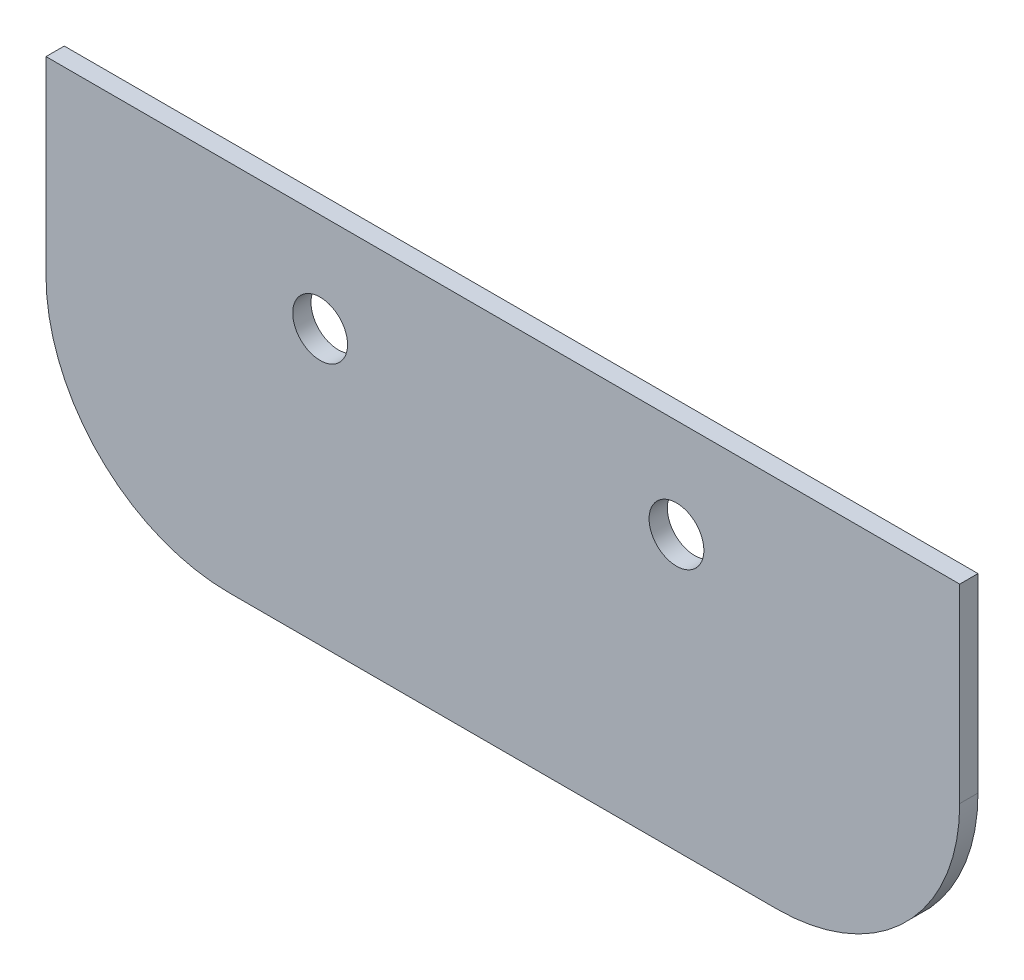
ISO-10303-21;
HEADER;
FILE_DESCRIPTION(('STEP AP214'),'2;1');
FILE_NAME('part.step','',(''),(''),'','','');
FILE_SCHEMA(('AUTOMOTIVE_DESIGN { 1 0 10303 214 1 1 1 1 }'));
ENDSEC;
DATA;
#1=APPLICATION_CONTEXT('core data for automotive mechanical design processes');
#2=APPLICATION_PROTOCOL_DEFINITION('international standard','automotive_design',2000,#1);
#3=PRODUCT_CONTEXT('',#1,'mechanical');
#4=PRODUCT('Part','Part','',(#3));
#5=PRODUCT_RELATED_PRODUCT_CATEGORY('part','',(#4));
#6=PRODUCT_DEFINITION_FORMATION('','',#4);
#7=PRODUCT_DEFINITION_CONTEXT('part definition',#1,'design');
#8=PRODUCT_DEFINITION('design','',#6,#7);
#9=PRODUCT_DEFINITION_SHAPE('','',#8);
#10=(LENGTH_UNIT() NAMED_UNIT(*) SI_UNIT(.MILLI.,.METRE.));
#11=(NAMED_UNIT(*) PLANE_ANGLE_UNIT() SI_UNIT($,.RADIAN.));
#12=(NAMED_UNIT(*) SI_UNIT($,.STERADIAN.) SOLID_ANGLE_UNIT());
#13=UNCERTAINTY_MEASURE_WITH_UNIT(LENGTH_MEASURE(1.E-05),#10,'distance_accuracy_value','');
#14=(GEOMETRIC_REPRESENTATION_CONTEXT(3) GLOBAL_UNCERTAINTY_ASSIGNED_CONTEXT((#13)) GLOBAL_UNIT_ASSIGNED_CONTEXT((#10,
#11,#12)) REPRESENTATION_CONTEXT('',''));
#15=CARTESIAN_POINT('',(0.,0.,0.));
#16=DIRECTION('',(0.,0.,1.));
#17=DIRECTION('',(1.,0.,0.));
#18=AXIS2_PLACEMENT_3D('',#15,#16,#17);
#19=CARTESIAN_POINT('',(0.,0.,1.));
#20=DIRECTION('',(0.,0.,-1.));
#21=DIRECTION('',(-1.,0.,0.));
#22=AXIS2_PLACEMENT_3D('',#19,#20,#21);
#23=PLANE('',#22);
#24=CARTESIAN_POINT('',(34.5,15.,1.));
#25=DIRECTION('',(0.,0.,1.));
#26=DIRECTION('',(1.,0.,0.));
#27=AXIS2_PLACEMENT_3D('',#24,#25,#26);
#28=CIRCLE('',#27,1.5);
#29=CARTESIAN_POINT('',(36.,15.,1.));
#30=VERTEX_POINT('',#29);
#31=EDGE_CURVE('E118',#30,#30,#28,.T.);
#32=ORIENTED_EDGE('',*,*,#31,.F.);
#33=EDGE_LOOP('',(#32));
#34=FACE_BOUND('',#33,.T.);
#35=DIRECTION('',(1.,0.,0.));
#36=VECTOR('',#35,1.);
#37=CARTESIAN_POINT('',(0.,0.,1.));
#38=LINE('',#37,#36);
#39=CARTESIAN_POINT('',(10.,0.,1.));
#40=VERTEX_POINT('',#39);
#41=CARTESIAN_POINT('',(40.,0.,1.));
#42=VERTEX_POINT('',#41);
#43=EDGE_CURVE('E96',#40,#42,#38,.T.);
#44=ORIENTED_EDGE('',*,*,#43,.T.);
#45=CARTESIAN_POINT('',(40.,10.,1.));
#46=DIRECTION('',(0.,0.,-1.));
#47=DIRECTION('',(-1.,0.,0.));
#48=AXIS2_PLACEMENT_3D('',#45,#46,#47);
#49=CIRCLE('',#48,10.);
#50=CARTESIAN_POINT('',(50.,10.,1.));
#51=VERTEX_POINT('',#50);
#52=EDGE_CURVE('E11',#42,#51,#49,.F.);
#53=ORIENTED_EDGE('',*,*,#52,.T.);
#54=DIRECTION('',(0.,1.,0.));
#55=VECTOR('',#54,1.);
#56=CARTESIAN_POINT('',(50.,20.4006201265541,1.));
#57=LINE('',#56,#55);
#58=CARTESIAN_POINT('',(50.,20.4006201265541,1.));
#59=VERTEX_POINT('',#58);
#60=EDGE_CURVE('E85',#51,#59,#57,.T.);
#61=ORIENTED_EDGE('',*,*,#60,.T.);
#62=DIRECTION('',(-1.,0.,0.));
#63=VECTOR('',#62,1.);
#64=CARTESIAN_POINT('',(0.,20.4006201265541,1.));
#65=LINE('',#64,#63);
#66=CARTESIAN_POINT('',(0.,20.4006201265541,1.));
#67=VERTEX_POINT('',#66);
#68=EDGE_CURVE('E90',#59,#67,#65,.T.);
#69=ORIENTED_EDGE('',*,*,#68,.T.);
#70=DIRECTION('',(0.,-1.,0.));
#71=VECTOR('',#70,1.);
#72=CARTESIAN_POINT('',(0.,0.,1.));
#73=LINE('',#72,#71);
#74=CARTESIAN_POINT('',(0.,10.,1.));
#75=VERTEX_POINT('',#74);
#76=EDGE_CURVE('E122',#67,#75,#73,.T.);
#77=ORIENTED_EDGE('',*,*,#76,.T.);
#78=CARTESIAN_POINT('',(10.,10.,1.));
#79=DIRECTION('',(0.,0.,-1.));
#80=DIRECTION('',(-1.,0.,0.));
#81=AXIS2_PLACEMENT_3D('',#78,#79,#80);
#82=CIRCLE('',#81,10.);
#83=EDGE_CURVE('E130',#75,#40,#82,.F.);
#84=ORIENTED_EDGE('',*,*,#83,.T.);
#85=EDGE_LOOP('',(#44,#53,#61,#69,#77,#84));
#86=FACE_BOUND('',#85,.T.);
#87=CARTESIAN_POINT('',(15.,15.,1.));
#88=DIRECTION('',(0.,0.,1.));
#89=DIRECTION('',(1.,0.,0.));
#90=AXIS2_PLACEMENT_3D('',#87,#88,#89);
#91=CIRCLE('',#90,1.5);
#92=CARTESIAN_POINT('',(16.5,15.,1.));
#93=VERTEX_POINT('',#92);
#94=EDGE_CURVE('E147',#93,#93,#91,.T.);
#95=ORIENTED_EDGE('',*,*,#94,.F.);
#96=EDGE_LOOP('',(#95));
#97=FACE_BOUND('',#96,.T.);
#98=ADVANCED_FACE('F33',(#34,#86,#97),#23,.F.);
#99=CARTESIAN_POINT('',(0.,0.,0.));
#100=DIRECTION('',(0.,0.,-1.));
#101=DIRECTION('',(-1.,0.,0.));
#102=AXIS2_PLACEMENT_3D('',#99,#100,#101);
#103=PLANE('',#102);
#104=CARTESIAN_POINT('',(34.5,15.,0.));
#105=DIRECTION('',(0.,0.,1.));
#106=DIRECTION('',(1.,0.,0.));
#107=AXIS2_PLACEMENT_3D('',#104,#105,#106);
#108=CIRCLE('',#107,1.5);
#109=CARTESIAN_POINT('',(36.,15.,0.));
#110=VERTEX_POINT('',#109);
#111=EDGE_CURVE('E144',#110,#110,#108,.T.);
#112=ORIENTED_EDGE('',*,*,#111,.T.);
#113=EDGE_LOOP('',(#112));
#114=FACE_BOUND('',#113,.T.);
#115=DIRECTION('',(0.,1.,0.));
#116=VECTOR('',#115,1.);
#117=CARTESIAN_POINT('',(50.,20.4006201265541,0.));
#118=LINE('',#117,#116);
#119=CARTESIAN_POINT('',(50.,10.,0.));
#120=VERTEX_POINT('',#119);
#121=CARTESIAN_POINT('',(50.,20.4006201265541,0.));
#122=VERTEX_POINT('',#121);
#123=EDGE_CURVE('E101',#120,#122,#118,.T.);
#124=ORIENTED_EDGE('',*,*,#123,.F.);
#125=CARTESIAN_POINT('',(40.,10.,0.));
#126=DIRECTION('',(0.,0.,-1.));
#127=DIRECTION('',(-1.,0.,0.));
#128=AXIS2_PLACEMENT_3D('',#125,#126,#127);
#129=CIRCLE('',#128,10.);
#130=CARTESIAN_POINT('',(40.,0.,0.));
#131=VERTEX_POINT('',#130);
#132=EDGE_CURVE('E55',#120,#131,#129,.T.);
#133=ORIENTED_EDGE('',*,*,#132,.T.);
#134=DIRECTION('',(1.,0.,0.));
#135=VECTOR('',#134,1.);
#136=CARTESIAN_POINT('',(0.,0.,0.));
#137=LINE('',#136,#135);
#138=CARTESIAN_POINT('',(10.,0.,0.));
#139=VERTEX_POINT('',#138);
#140=EDGE_CURVE('E117',#139,#131,#137,.T.);
#141=ORIENTED_EDGE('',*,*,#140,.F.);
#142=CARTESIAN_POINT('',(10.,10.,0.));
#143=DIRECTION('',(0.,0.,-1.));
#144=DIRECTION('',(-1.,0.,0.));
#145=AXIS2_PLACEMENT_3D('',#142,#143,#144);
#146=CIRCLE('',#145,10.);
#147=CARTESIAN_POINT('',(0.,10.,0.));
#148=VERTEX_POINT('',#147);
#149=EDGE_CURVE('E126',#139,#148,#146,.T.);
#150=ORIENTED_EDGE('',*,*,#149,.T.);
#151=DIRECTION('',(0.,-1.,0.));
#152=VECTOR('',#151,1.);
#153=CARTESIAN_POINT('',(0.,0.,0.));
#154=LINE('',#153,#152);
#155=CARTESIAN_POINT('',(0.,20.4006201265541,0.));
#156=VERTEX_POINT('',#155);
#157=EDGE_CURVE('E114',#156,#148,#154,.T.);
#158=ORIENTED_EDGE('',*,*,#157,.F.);
#159=DIRECTION('',(-1.,0.,0.));
#160=VECTOR('',#159,1.);
#161=CARTESIAN_POINT('',(0.,20.4006201265541,0.));
#162=LINE('',#161,#160);
#163=EDGE_CURVE('E121',#122,#156,#162,.T.);
#164=ORIENTED_EDGE('',*,*,#163,.F.);
#165=EDGE_LOOP('',(#124,#133,#141,#150,#158,#164));
#166=FACE_BOUND('',#165,.T.);
#167=CARTESIAN_POINT('',(15.,15.,0.));
#168=DIRECTION('',(0.,0.,1.));
#169=DIRECTION('',(1.,0.,0.));
#170=AXIS2_PLACEMENT_3D('',#167,#168,#169);
#171=CIRCLE('',#170,1.5);
#172=CARTESIAN_POINT('',(16.5,15.,0.));
#173=VERTEX_POINT('',#172);
#174=EDGE_CURVE('E150',#173,#173,#171,.T.);
#175=ORIENTED_EDGE('',*,*,#174,.T.);
#176=EDGE_LOOP('',(#175));
#177=FACE_BOUND('',#176,.T.);
#178=ADVANCED_FACE('F135',(#114,#166,#177),#103,.T.);
#179=CARTESIAN_POINT('',(0.,0.,1.));
#180=DIRECTION('',(1.,0.,0.));
#181=DIRECTION('',(0.,0.,-1.));
#182=AXIS2_PLACEMENT_3D('',#179,#180,#181);
#183=PLANE('',#182);
#184=ORIENTED_EDGE('',*,*,#157,.T.);
#185=DIRECTION('',(0.,0.,-1.));
#186=VECTOR('',#185,1.);
#187=CARTESIAN_POINT('',(0.,10.,1.));
#188=LINE('',#187,#186);
#189=EDGE_CURVE('E128',#148,#75,#188,.F.);
#190=ORIENTED_EDGE('',*,*,#189,.T.);
#191=ORIENTED_EDGE('',*,*,#76,.F.);
#192=DIRECTION('',(0.,0.,-1.));
#193=VECTOR('',#192,1.);
#194=CARTESIAN_POINT('',(0.,20.4006201265541,1.));
#195=LINE('',#194,#193);
#196=EDGE_CURVE('E105',#67,#156,#195,.T.);
#197=ORIENTED_EDGE('',*,*,#196,.T.);
#198=EDGE_LOOP('',(#184,#190,#191,#197));
#199=FACE_BOUND('',#198,.T.);
#200=ADVANCED_FACE('F139',(#199),#183,.F.);
#201=CARTESIAN_POINT('',(0.,0.,1.));
#202=DIRECTION('',(0.,1.,0.));
#203=DIRECTION('',(0.,0.,1.));
#204=AXIS2_PLACEMENT_3D('',#201,#202,#203);
#205=PLANE('',#204);
#206=ORIENTED_EDGE('',*,*,#140,.T.);
#207=DIRECTION('',(0.,0.,-1.));
#208=VECTOR('',#207,1.);
#209=CARTESIAN_POINT('',(40.,0.,1.));
#210=LINE('',#209,#208);
#211=EDGE_CURVE('E41',#131,#42,#210,.F.);
#212=ORIENTED_EDGE('',*,*,#211,.T.);
#213=ORIENTED_EDGE('',*,*,#43,.F.);
#214=DIRECTION('',(0.,0.,-1.));
#215=VECTOR('',#214,1.);
#216=CARTESIAN_POINT('',(10.,0.,1.));
#217=LINE('',#216,#215);
#218=EDGE_CURVE('E104',#40,#139,#217,.T.);
#219=ORIENTED_EDGE('',*,*,#218,.T.);
#220=EDGE_LOOP('',(#206,#212,#213,#219));
#221=FACE_BOUND('',#220,.T.);
#222=ADVANCED_FACE('F175',(#221),#205,.F.);
#223=CARTESIAN_POINT('',(50.,20.4006201265541,1.));
#224=DIRECTION('',(-1.,0.,0.));
#225=DIRECTION('',(0.,0.,1.));
#226=AXIS2_PLACEMENT_3D('',#223,#224,#225);
#227=PLANE('',#226);
#228=ORIENTED_EDGE('',*,*,#60,.F.);
#229=DIRECTION('',(0.,0.,-1.));
#230=VECTOR('',#229,1.);
#231=CARTESIAN_POINT('',(50.,10.,1.));
#232=LINE('',#231,#230);
#233=EDGE_CURVE('E132',#51,#120,#232,.T.);
#234=ORIENTED_EDGE('',*,*,#233,.T.);
#235=ORIENTED_EDGE('',*,*,#123,.T.);
#236=DIRECTION('',(0.,0.,-1.));
#237=VECTOR('',#236,1.);
#238=CARTESIAN_POINT('',(50.,20.4006201265541,1.));
#239=LINE('',#238,#237);
#240=EDGE_CURVE('E99',#59,#122,#239,.T.);
#241=ORIENTED_EDGE('',*,*,#240,.F.);
#242=EDGE_LOOP('',(#228,#234,#235,#241));
#243=FACE_BOUND('',#242,.T.);
#244=ADVANCED_FACE('F100',(#243),#227,.F.);
#245=CARTESIAN_POINT('',(0.,20.4006201265541,1.));
#246=DIRECTION('',(0.,-1.,0.));
#247=DIRECTION('',(0.,0.,-1.));
#248=AXIS2_PLACEMENT_3D('',#245,#246,#247);
#249=PLANE('',#248);
#250=ORIENTED_EDGE('',*,*,#163,.T.);
#251=ORIENTED_EDGE('',*,*,#196,.F.);
#252=ORIENTED_EDGE('',*,*,#68,.F.);
#253=ORIENTED_EDGE('',*,*,#240,.T.);
#254=EDGE_LOOP('',(#250,#251,#252,#253));
#255=FACE_BOUND('',#254,.T.);
#256=ADVANCED_FACE('F107',(#255),#249,.F.);
#257=CARTESIAN_POINT('',(34.5,15.,1.));
#258=DIRECTION('',(0.,0.,-1.));
#259=DIRECTION('',(-1.,0.,0.));
#260=AXIS2_PLACEMENT_3D('',#257,#258,#259);
#261=CYLINDRICAL_SURFACE('',#260,1.5);
#262=ORIENTED_EDGE('',*,*,#31,.T.);
#263=EDGE_LOOP('',(#262));
#264=FACE_BOUND('',#263,.T.);
#265=ORIENTED_EDGE('',*,*,#111,.F.);
#266=EDGE_LOOP('',(#265));
#267=FACE_BOUND('',#266,.T.);
#268=ADVANCED_FACE('F168',(#264,#267),#261,.F.);
#269=CARTESIAN_POINT('',(15.,15.,1.));
#270=DIRECTION('',(0.,0.,-1.));
#271=DIRECTION('',(-1.,0.,0.));
#272=AXIS2_PLACEMENT_3D('',#269,#270,#271);
#273=CYLINDRICAL_SURFACE('',#272,1.5);
#274=ORIENTED_EDGE('',*,*,#94,.T.);
#275=EDGE_LOOP('',(#274));
#276=FACE_BOUND('',#275,.T.);
#277=ORIENTED_EDGE('',*,*,#174,.F.);
#278=EDGE_LOOP('',(#277));
#279=FACE_BOUND('',#278,.T.);
#280=ADVANCED_FACE('F156',(#276,#279),#273,.F.);
#281=CARTESIAN_POINT('',(10.,10.,1.));
#282=DIRECTION('',(0.,0.,-1.));
#283=DIRECTION('',(-1.,0.,0.));
#284=AXIS2_PLACEMENT_3D('',#281,#282,#283);
#285=CYLINDRICAL_SURFACE('',#284,10.);
#286=ORIENTED_EDGE('',*,*,#83,.F.);
#287=ORIENTED_EDGE('',*,*,#189,.F.);
#288=ORIENTED_EDGE('',*,*,#149,.F.);
#289=ORIENTED_EDGE('',*,*,#218,.F.);
#290=EDGE_LOOP('',(#286,#287,#288,#289));
#291=FACE_BOUND('',#290,.T.);
#292=ADVANCED_FACE('F179',(#291),#285,.T.);
#293=CARTESIAN_POINT('',(40.,10.,1.));
#294=DIRECTION('',(0.,0.,-1.));
#295=DIRECTION('',(-1.,0.,0.));
#296=AXIS2_PLACEMENT_3D('',#293,#294,#295);
#297=CYLINDRICAL_SURFACE('',#296,10.);
#298=ORIENTED_EDGE('',*,*,#52,.F.);
#299=ORIENTED_EDGE('',*,*,#211,.F.);
#300=ORIENTED_EDGE('',*,*,#132,.F.);
#301=ORIENTED_EDGE('',*,*,#233,.F.);
#302=EDGE_LOOP('',(#298,#299,#300,#301));
#303=FACE_BOUND('',#302,.T.);
#304=ADVANCED_FACE('F35',(#303),#297,.T.);
#305=CLOSED_SHELL('',(#98,#178,#200,#222,#244,#256,#268,#280,#292,#304));
#306=MANIFOLD_SOLID_BREP('B2',#305);
#307=ADVANCED_BREP_SHAPE_REPRESENTATION('',(#18,#306),#14);
#308=SHAPE_DEFINITION_REPRESENTATION(#9,#307);
ENDSEC;
END-ISO-10303-21;
